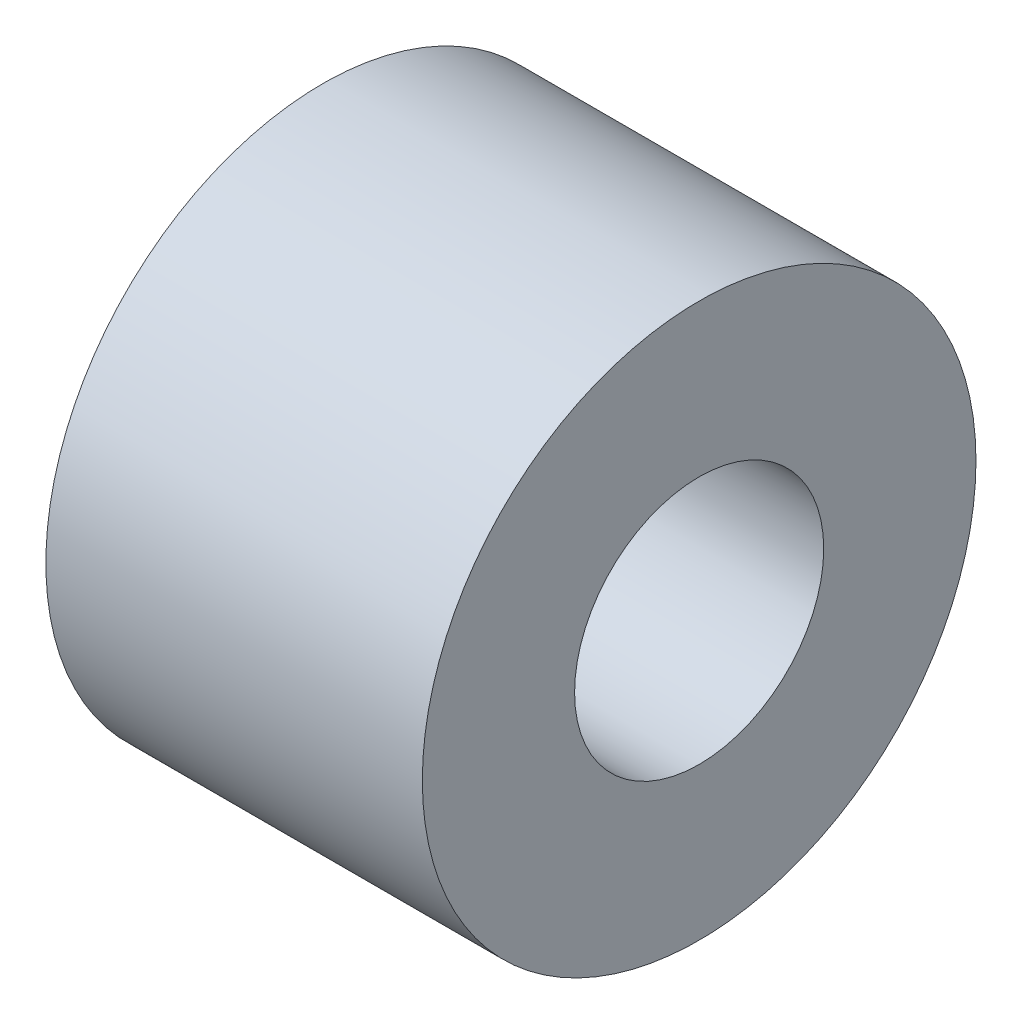
ISO-10303-21;
HEADER;
FILE_DESCRIPTION(('STEP AP214'),'2;1');
FILE_NAME('part.step','',(''),(''),'','','');
FILE_SCHEMA(('AUTOMOTIVE_DESIGN { 1 0 10303 214 1 1 1 1 }'));
ENDSEC;
DATA;
#1=APPLICATION_CONTEXT('core data for automotive mechanical design processes');
#2=APPLICATION_PROTOCOL_DEFINITION('international standard','automotive_design',2000,#1);
#3=PRODUCT_CONTEXT('',#1,'mechanical');
#4=PRODUCT('Part','Part','',(#3));
#5=PRODUCT_RELATED_PRODUCT_CATEGORY('part','',(#4));
#6=PRODUCT_DEFINITION_FORMATION('','',#4);
#7=PRODUCT_DEFINITION_CONTEXT('part definition',#1,'design');
#8=PRODUCT_DEFINITION('design','',#6,#7);
#9=PRODUCT_DEFINITION_SHAPE('','',#8);
#10=(LENGTH_UNIT() NAMED_UNIT(*) SI_UNIT(.MILLI.,.METRE.));
#11=(NAMED_UNIT(*) PLANE_ANGLE_UNIT() SI_UNIT($,.RADIAN.));
#12=(NAMED_UNIT(*) SI_UNIT($,.STERADIAN.) SOLID_ANGLE_UNIT());
#13=UNCERTAINTY_MEASURE_WITH_UNIT(LENGTH_MEASURE(1.E-05),#10,'distance_accuracy_value','');
#14=(GEOMETRIC_REPRESENTATION_CONTEXT(3) GLOBAL_UNCERTAINTY_ASSIGNED_CONTEXT((#13)) GLOBAL_UNIT_ASSIGNED_CONTEXT((#10,
#11,#12)) REPRESENTATION_CONTEXT('',''));
#15=CARTESIAN_POINT('',(0.,0.,0.));
#16=DIRECTION('',(0.,0.,1.));
#17=DIRECTION('',(1.,0.,0.));
#18=AXIS2_PLACEMENT_3D('',#15,#16,#17);
#19=CARTESIAN_POINT('',(3.4,0.,0.));
#20=DIRECTION('',(1.,0.,0.));
#21=DIRECTION('',(0.,0.,-1.));
#22=AXIS2_PLACEMENT_3D('',#19,#20,#21);
#23=PLANE('',#22);
#24=CARTESIAN_POINT('',(3.4,0.,0.));
#25=DIRECTION('',(1.,0.,0.));
#26=DIRECTION('',(0.,0.,-1.));
#27=AXIS2_PLACEMENT_3D('',#24,#25,#26);
#28=CIRCLE('',#27,2.25);
#29=CARTESIAN_POINT('',(3.4,0.,-2.25));
#30=VERTEX_POINT('',#29);
#31=EDGE_CURVE('E26',#30,#30,#28,.T.);
#32=ORIENTED_EDGE('',*,*,#31,.F.);
#33=EDGE_LOOP('',(#32));
#34=FACE_BOUND('',#33,.T.);
#35=CARTESIAN_POINT('',(3.4,0.,0.));
#36=DIRECTION('',(-1.,0.,0.));
#37=DIRECTION('',(0.,0.,1.));
#38=AXIS2_PLACEMENT_3D('',#35,#36,#37);
#39=CIRCLE('',#38,5.);
#40=CARTESIAN_POINT('',(3.4,0.,5.));
#41=VERTEX_POINT('',#40);
#42=EDGE_CURVE('E9',#41,#41,#39,.T.);
#43=ORIENTED_EDGE('',*,*,#42,.F.);
#44=EDGE_LOOP('',(#43));
#45=FACE_BOUND('',#44,.T.);
#46=ADVANCED_FACE('F14',(#34,#45),#23,.T.);
#47=CARTESIAN_POINT('',(-3.4,0.,0.));
#48=DIRECTION('',(-1.,0.,0.));
#49=DIRECTION('',(0.,0.,1.));
#50=AXIS2_PLACEMENT_3D('',#47,#48,#49);
#51=PLANE('',#50);
#52=CARTESIAN_POINT('',(-3.4,0.,0.));
#53=DIRECTION('',(-1.,0.,0.));
#54=DIRECTION('',(0.,0.,1.));
#55=AXIS2_PLACEMENT_3D('',#52,#53,#54);
#56=CIRCLE('',#55,2.25);
#57=CARTESIAN_POINT('',(-3.4,0.,2.25));
#58=VERTEX_POINT('',#57);
#59=EDGE_CURVE('E18',#58,#58,#56,.T.);
#60=ORIENTED_EDGE('',*,*,#59,.F.);
#61=EDGE_LOOP('',(#60));
#62=FACE_BOUND('',#61,.T.);
#63=CARTESIAN_POINT('',(-3.4,0.,0.));
#64=DIRECTION('',(1.,0.,0.));
#65=DIRECTION('',(0.,0.,-1.));
#66=AXIS2_PLACEMENT_3D('',#63,#64,#65);
#67=CIRCLE('',#66,5.);
#68=CARTESIAN_POINT('',(-3.4,0.,-5.));
#69=VERTEX_POINT('',#68);
#70=EDGE_CURVE('E22',#69,#69,#67,.T.);
#71=ORIENTED_EDGE('',*,*,#70,.F.);
#72=EDGE_LOOP('',(#71));
#73=FACE_BOUND('',#72,.T.);
#74=ADVANCED_FACE('F37',(#62,#73),#51,.T.);
#75=CARTESIAN_POINT('',(-3.4,0.,0.));
#76=DIRECTION('',(1.,0.,0.));
#77=DIRECTION('',(0.,0.,-1.));
#78=AXIS2_PLACEMENT_3D('',#75,#76,#77);
#79=CYLINDRICAL_SURFACE('',#78,5.);
#80=ORIENTED_EDGE('',*,*,#42,.T.);
#81=EDGE_LOOP('',(#80));
#82=FACE_BOUND('',#81,.T.);
#83=ORIENTED_EDGE('',*,*,#70,.T.);
#84=EDGE_LOOP('',(#83));
#85=FACE_BOUND('',#84,.T.);
#86=ADVANCED_FACE('F16',(#82,#85),#79,.T.);
#87=CARTESIAN_POINT('',(-3.7,0.,0.));
#88=DIRECTION('',(1.,0.,0.));
#89=DIRECTION('',(0.,0.,-1.));
#90=AXIS2_PLACEMENT_3D('',#87,#88,#89);
#91=CYLINDRICAL_SURFACE('',#90,2.25);
#92=ORIENTED_EDGE('',*,*,#31,.T.);
#93=EDGE_LOOP('',(#92));
#94=FACE_BOUND('',#93,.T.);
#95=ORIENTED_EDGE('',*,*,#59,.T.);
#96=EDGE_LOOP('',(#95));
#97=FACE_BOUND('',#96,.T.);
#98=ADVANCED_FACE('F35',(#94,#97),#91,.F.);
#99=CLOSED_SHELL('',(#46,#74,#86,#98));
#100=MANIFOLD_SOLID_BREP('B1',#99);
#101=ADVANCED_BREP_SHAPE_REPRESENTATION('',(#18,#100),#14);
#102=SHAPE_DEFINITION_REPRESENTATION(#9,#101);
ENDSEC;
END-ISO-10303-21;
